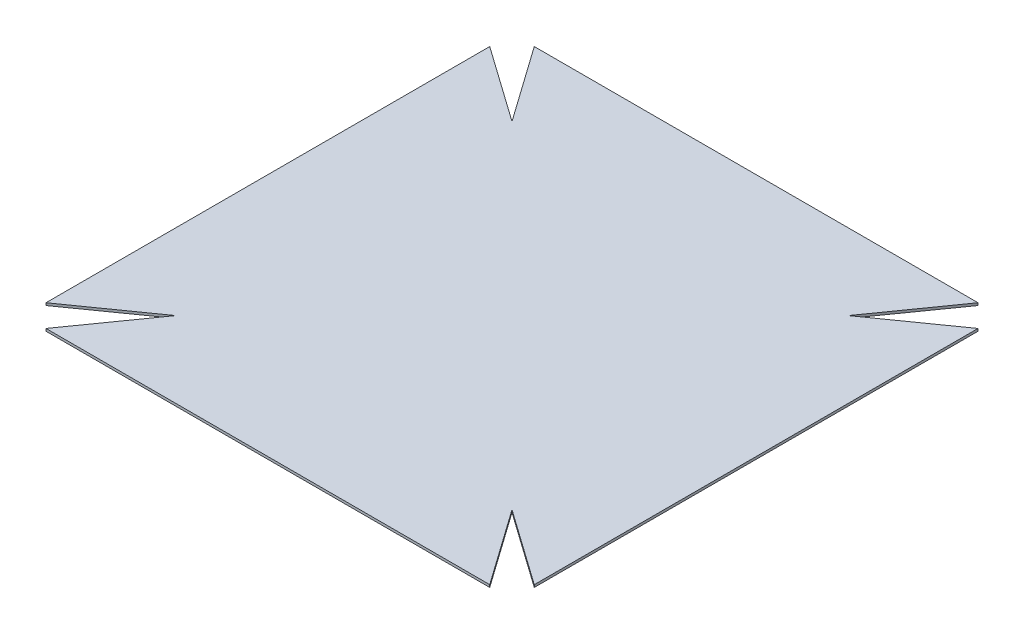
ISO-10303-21;
HEADER;
FILE_DESCRIPTION(('STEP AP214'),'2;1');
FILE_NAME('part.step','',(''),(''),'','','');
FILE_SCHEMA(('AUTOMOTIVE_DESIGN { 1 0 10303 214 1 1 1 1 }'));
ENDSEC;
DATA;
#1=APPLICATION_CONTEXT('core data for automotive mechanical design processes');
#2=APPLICATION_PROTOCOL_DEFINITION('international standard','automotive_design',2000,#1);
#3=PRODUCT_CONTEXT('',#1,'mechanical');
#4=PRODUCT('Part','Part','',(#3));
#5=PRODUCT_RELATED_PRODUCT_CATEGORY('part','',(#4));
#6=PRODUCT_DEFINITION_FORMATION('','',#4);
#7=PRODUCT_DEFINITION_CONTEXT('part definition',#1,'design');
#8=PRODUCT_DEFINITION('design','',#6,#7);
#9=PRODUCT_DEFINITION_SHAPE('','',#8);
#10=(LENGTH_UNIT() NAMED_UNIT(*) SI_UNIT(.MILLI.,.METRE.));
#11=(NAMED_UNIT(*) PLANE_ANGLE_UNIT() SI_UNIT($,.RADIAN.));
#12=(NAMED_UNIT(*) SI_UNIT($,.STERADIAN.) SOLID_ANGLE_UNIT());
#13=UNCERTAINTY_MEASURE_WITH_UNIT(LENGTH_MEASURE(1.E-05),#10,'distance_accuracy_value','');
#14=(GEOMETRIC_REPRESENTATION_CONTEXT(3) GLOBAL_UNCERTAINTY_ASSIGNED_CONTEXT((#13)) GLOBAL_UNIT_ASSIGNED_CONTEXT((#10,
#11,#12)) REPRESENTATION_CONTEXT('',''));
#15=CARTESIAN_POINT('',(0.,0.,0.));
#16=DIRECTION('',(0.,0.,1.));
#17=DIRECTION('',(1.,0.,0.));
#18=AXIS2_PLACEMENT_3D('',#15,#16,#17);
#19=CARTESIAN_POINT('',(0.,-0.50000000000016,-3.98986399474666E-13));
#20=DIRECTION('',(0.,-1.,0.));
#21=DIRECTION('',(0.,0.,-1.));
#22=AXIS2_PLACEMENT_3D('',#19,#20,#21);
#23=PLANE('',#22);
#24=DIRECTION('',(0.57735026918963,0.,-0.816496580927723));
#25=VECTOR('',#24,1.);
#26=CARTESIAN_POINT('',(35.2221825406964,-0.500000000000153,-35.5675341418741));
#27=LINE('',#26,#25);
#28=CARTESIAN_POINT('',(34.3884300213427,-0.500000000000154,-34.3884300213414));
#29=VERTEX_POINT('',#28);
#30=CARTESIAN_POINT('',(45.3894444302746,-0.500000000000261,-49.9462137983145));
#31=VERTEX_POINT('',#30);
#32=EDGE_CURVE('E302',#29,#31,#27,.T.);
#33=ORIENTED_EDGE('',*,*,#32,.F.);
#34=DIRECTION('',(0.816496580927717,0.,-0.577350269189639));
#35=VECTOR('',#34,1.);
#36=CARTESIAN_POINT('',(35.5675341418738,-0.500000000000278,-35.2221825406939));
#37=LINE('',#36,#35);
#38=CARTESIAN_POINT('',(49.946213798314,-0.500000000000216,-45.3894444302722));
#39=VERTEX_POINT('',#38);
#40=EDGE_CURVE('E310',#29,#39,#37,.T.);
#41=ORIENTED_EDGE('',*,*,#40,.T.);
#42=DIRECTION('',(0.,0.,1.));
#43=VECTOR('',#42,1.);
#44=CARTESIAN_POINT('',(49.9462137983152,-0.500000000000507,34.9999999999998));
#45=LINE('',#44,#43);
#46=CARTESIAN_POINT('',(49.9462137983154,-0.500000000000684,45.389444430272));
#47=VERTEX_POINT('',#46);
#48=EDGE_CURVE('E202',#39,#47,#45,.T.);
#49=ORIENTED_EDGE('',*,*,#48,.T.);
#50=DIRECTION('',(0.816496580927738,0.,0.577350269189609));
#51=VECTOR('',#50,1.);
#52=CARTESIAN_POINT('',(35.5675341418751,-0.500000000000403,35.2221825406945));
#53=LINE('',#52,#51);
#54=CARTESIAN_POINT('',(34.3884300213399,-0.500000000000416,34.388430021339));
#55=VERTEX_POINT('',#54);
#56=EDGE_CURVE('E182',#55,#47,#53,.T.);
#57=ORIENTED_EDGE('',*,*,#56,.F.);
#58=DIRECTION('',(0.577350269189628,0.,0.816496580927725));
#59=VECTOR('',#58,1.);
#60=CARTESIAN_POINT('',(35.2221825406947,-0.50000000000016,35.5675341418733));
#61=LINE('',#60,#59);
#62=CARTESIAN_POINT('',(45.3894444302728,-0.500000000000268,49.9462137983137));
#63=VERTEX_POINT('',#62);
#64=EDGE_CURVE('E338',#55,#63,#61,.T.);
#65=ORIENTED_EDGE('',*,*,#64,.T.);
#66=DIRECTION('',(-1.,0.,0.));
#67=VECTOR('',#66,1.);
#68=CARTESIAN_POINT('',(-35.,-0.500000000000257,49.9462137983137));
#69=LINE('',#68,#67);
#70=CARTESIAN_POINT('',(-45.3894444302732,-0.500000000000254,49.9462137983137));
#71=VERTEX_POINT('',#70);
#72=EDGE_CURVE('E267',#63,#71,#69,.T.);
#73=ORIENTED_EDGE('',*,*,#72,.T.);
#74=DIRECTION('',(-0.577350269189629,0.,0.816496580927724));
#75=VECTOR('',#74,1.);
#76=CARTESIAN_POINT('',(-35.2221825406951,-0.50000000000015,35.5675341418733));
#77=LINE('',#76,#75);
#78=CARTESIAN_POINT('',(-34.3884300213423,-0.500000000000139,34.3884300213418));
#79=VERTEX_POINT('',#78);
#80=EDGE_CURVE('E324',#79,#71,#77,.T.);
#81=ORIENTED_EDGE('',*,*,#80,.F.);
#82=DIRECTION('',(-0.816496580927721,0.,0.577350269189633));
#83=VECTOR('',#82,1.);
#84=CARTESIAN_POINT('',(-35.5675341418737,-0.500000000000202,35.2221825406946));
#85=LINE('',#84,#83);
#86=CARTESIAN_POINT('',(-49.946213798314,-0.500000000000309,45.3894444302728));
#87=VERTEX_POINT('',#86);
#88=EDGE_CURVE('E361',#79,#87,#85,.T.);
#89=ORIENTED_EDGE('',*,*,#88,.T.);
#90=DIRECTION('',(0.,0.,-1.));
#91=VECTOR('',#90,1.);
#92=CARTESIAN_POINT('',(-49.9462137983145,-0.500000000000358,-35.0000000000005));
#93=LINE('',#92,#91);
#94=CARTESIAN_POINT('',(-49.9462137983145,-0.500000000000365,-45.3894444302731));
#95=VERTEX_POINT('',#94);
#96=EDGE_CURVE('E245',#87,#95,#93,.T.);
#97=ORIENTED_EDGE('',*,*,#96,.T.);
#98=DIRECTION('',(-0.816496580927727,0.,-0.577350269189624));
#99=VECTOR('',#98,1.);
#100=CARTESIAN_POINT('',(-35.5675341418742,-0.500000000000254,-35.2221825406951));
#101=LINE('',#100,#99);
#102=CARTESIAN_POINT('',(-34.3884300213413,-0.50000000000025,-34.3884300213413));
#103=VERTEX_POINT('',#102);
#104=EDGE_CURVE('E347',#103,#95,#101,.T.);
#105=ORIENTED_EDGE('',*,*,#104,.F.);
#106=DIRECTION('',(-0.577350269189628,0.,-0.816496580927724));
#107=VECTOR('',#106,1.);
#108=CARTESIAN_POINT('',(-35.2221825406951,-0.50000000000016,-35.5675341418741));
#109=LINE('',#108,#107);
#110=CARTESIAN_POINT('',(-45.3894444302732,-0.500000000000254,-49.9462137983145));
#111=VERTEX_POINT('',#110);
#112=EDGE_CURVE('E378',#103,#111,#109,.T.);
#113=ORIENTED_EDGE('',*,*,#112,.T.);
#114=DIRECTION('',(1.,0.,0.));
#115=VECTOR('',#114,1.);
#116=CARTESIAN_POINT('',(35.,-0.500000000000264,-49.9462137983145));
#117=LINE('',#116,#115);
#118=EDGE_CURVE('E223',#111,#31,#117,.T.);
#119=ORIENTED_EDGE('',*,*,#118,.T.);
#120=EDGE_LOOP('',(#33,#41,#49,#57,#65,#73,#81,#89,#97,#105,#113,#119));
#121=FACE_BOUND('',#120,.T.);
#122=ADVANCED_FACE('F172',(#121),#23,.T.);
#123=CARTESIAN_POINT('',(0.,-1.6306400674182E-13,-3.98986399474666E-13));
#124=DIRECTION('',(0.,-1.,0.));
#125=DIRECTION('',(0.,0.,-1.));
#126=AXIS2_PLACEMENT_3D('',#123,#124,#125);
#127=PLANE('',#126);
#128=DIRECTION('',(0.577350269189628,0.,0.816496580927725));
#129=VECTOR('',#128,1.);
#130=CARTESIAN_POINT('',(35.2221825406947,-1.59594559789866E-13,35.5675341418733));
#131=LINE('',#130,#129);
#132=CARTESIAN_POINT('',(34.3884300213399,-4.1589995336544E-13,34.388430021339));
#133=VERTEX_POINT('',#132);
#134=CARTESIAN_POINT('',(45.3894444302728,-2.60208521396521E-13,49.9462137983137));
#135=VERTEX_POINT('',#134);
#136=EDGE_CURVE('E331',#133,#135,#131,.T.);
#137=ORIENTED_EDGE('',*,*,#136,.F.);
#138=DIRECTION('',(0.816496580927738,0.,0.577350269189609));
#139=VECTOR('',#138,1.);
#140=CARTESIAN_POINT('',(35.5675341418751,-4.1286418728248E-13,35.2221825406945));
#141=LINE('',#140,#139);
#142=CARTESIAN_POINT('',(49.9462137983154,-6.76542155630955E-13,45.389444430272));
#143=VERTEX_POINT('',#142);
#144=EDGE_CURVE('E274',#133,#143,#141,.T.);
#145=ORIENTED_EDGE('',*,*,#144,.T.);
#146=DIRECTION('',(0.,0.,1.));
#147=VECTOR('',#146,1.);
#148=CARTESIAN_POINT('',(49.9462137983152,-5.16947595841089E-13,34.9999999999998));
#149=LINE('',#148,#147);
#150=CARTESIAN_POINT('',(49.946213798314,-2.1163626406917E-13,-45.3894444302722));
#151=VERTEX_POINT('',#150);
#152=EDGE_CURVE('E176',#151,#143,#149,.T.);
#153=ORIENTED_EDGE('',*,*,#152,.F.);
#154=DIRECTION('',(0.816496580927717,0.,-0.577350269189639));
#155=VECTOR('',#154,1.);
#156=CARTESIAN_POINT('',(35.5675341418738,-2.74086309204336E-13,-35.2221825406939));
#157=LINE('',#156,#155);
#158=CARTESIAN_POINT('',(34.3884300213427,-1.53523027623947E-13,-34.3884300213414));
#159=VERTEX_POINT('',#158);
#160=EDGE_CURVE('E305',#159,#151,#157,.T.);
#161=ORIENTED_EDGE('',*,*,#160,.F.);
#162=DIRECTION('',(0.57735026918963,0.,-0.816496580927723));
#163=VECTOR('',#162,1.);
#164=CARTESIAN_POINT('',(35.2221825406964,-1.52655665885959E-13,-35.5675341418741));
#165=LINE('',#164,#163);
#166=CARTESIAN_POINT('',(45.3894444302746,-2.53269627492614E-13,-49.9462137983145));
#167=VERTEX_POINT('',#166);
#168=EDGE_CURVE('E296',#159,#167,#165,.T.);
#169=ORIENTED_EDGE('',*,*,#168,.T.);
#170=DIRECTION('',(1.,0.,0.));
#171=VECTOR('',#170,1.);
#172=CARTESIAN_POINT('',(35.,-2.53269627492614E-13,-49.9462137983145));
#173=LINE('',#172,#171);
#174=CARTESIAN_POINT('',(-45.3894444302732,-2.53269627492614E-13,-49.9462137983145));
#175=VERTEX_POINT('',#174);
#176=EDGE_CURVE('E211',#175,#167,#173,.T.);
#177=ORIENTED_EDGE('',*,*,#176,.F.);
#178=DIRECTION('',(-0.577350269189628,0.,-0.816496580927724));
#179=VECTOR('',#178,1.);
#180=CARTESIAN_POINT('',(-35.2221825406951,-1.56125112837913E-13,-35.5675341418741));
#181=LINE('',#180,#179);
#182=CARTESIAN_POINT('',(-34.3884300213413,-2.50233861409654E-13,-34.3884300213413));
#183=VERTEX_POINT('',#182);
#184=EDGE_CURVE('E303',#183,#175,#181,.T.);
#185=ORIENTED_EDGE('',*,*,#184,.F.);
#186=DIRECTION('',(-0.816496580927727,0.,-0.577350269189624));
#187=VECTOR('',#186,1.);
#188=CARTESIAN_POINT('',(-35.5675341418742,-2.60208521396521E-13,-35.2221825406951));
#189=LINE('',#188,#187);
#190=CARTESIAN_POINT('',(-49.9462137983145,-3.57353036051222E-13,-45.3894444302731));
#191=VERTEX_POINT('',#190);
#192=EDGE_CURVE('E350',#183,#191,#189,.T.);
#193=ORIENTED_EDGE('',*,*,#192,.T.);
#194=DIRECTION('',(0.,0.,-1.));
#195=VECTOR('',#194,1.);
#196=CARTESIAN_POINT('',(-49.9462137983145,-3.57353036051222E-13,-35.0000000000005));
#197=LINE('',#196,#195);
#198=CARTESIAN_POINT('',(-49.946213798314,-3.15719672627779E-13,45.3894444302728));
#199=VERTEX_POINT('',#198);
#200=EDGE_CURVE('E233',#199,#191,#197,.T.);
#201=ORIENTED_EDGE('',*,*,#200,.F.);
#202=DIRECTION('',(-0.816496580927721,0.,0.577350269189633));
#203=VECTOR('',#202,1.);
#204=CARTESIAN_POINT('',(-35.5675341418738,-2.0122792321331E-13,35.2221825406946));
#205=LINE('',#204,#203);
#206=CARTESIAN_POINT('',(-34.3884300213423,-1.3910313872989E-13,34.3884300213418));
#207=VERTEX_POINT('',#206);
#208=EDGE_CURVE('E354',#207,#199,#205,.T.);
#209=ORIENTED_EDGE('',*,*,#208,.F.);
#210=DIRECTION('',(-0.577350269189629,0.,0.816496580927724));
#211=VECTOR('',#210,1.);
#212=CARTESIAN_POINT('',(-35.2221825406951,-1.49186218934005E-13,35.5675341418733));
#213=LINE('',#212,#211);
#214=CARTESIAN_POINT('',(-45.3894444302732,-2.4980018054066E-13,49.9462137983137));
#215=VERTEX_POINT('',#214);
#216=EDGE_CURVE('E327',#207,#215,#213,.T.);
#217=ORIENTED_EDGE('',*,*,#216,.T.);
#218=DIRECTION('',(-1.,0.,0.));
#219=VECTOR('',#218,1.);
#220=CARTESIAN_POINT('',(-35.,-2.4980018054066E-13,49.9462137983137));
#221=LINE('',#220,#219);
#222=EDGE_CURVE('E255',#135,#215,#221,.T.);
#223=ORIENTED_EDGE('',*,*,#222,.F.);
#224=EDGE_LOOP('',(#137,#145,#153,#161,#169,#177,#185,#193,#201,#209,#217,#223));
#225=FACE_BOUND('',#224,.T.);
#226=ADVANCED_FACE('F174',(#225),#127,.F.);
#227=CARTESIAN_POINT('',(49.9462137983152,-0.500000000000507,34.9999999999998));
#228=DIRECTION('',(-1.,0.,0.));
#229=DIRECTION('',(0.,-1.,0.));
#230=AXIS2_PLACEMENT_3D('',#227,#228,#229);
#231=PLANE('',#230);
#232=ORIENTED_EDGE('',*,*,#152,.T.);
#233=DIRECTION('',(0.,1.,0.));
#234=VECTOR('',#233,1.);
#235=CARTESIAN_POINT('',(49.9462137983154,-0.500000000000684,45.389444430272));
#236=LINE('',#235,#234);
#237=EDGE_CURVE('E12',#47,#143,#236,.T.);
#238=ORIENTED_EDGE('',*,*,#237,.F.);
#239=ORIENTED_EDGE('',*,*,#48,.F.);
#240=DIRECTION('',(0.,1.,0.));
#241=VECTOR('',#240,1.);
#242=CARTESIAN_POINT('',(49.946213798314,-0.500000000000216,-45.3894444302722));
#243=LINE('',#242,#241);
#244=EDGE_CURVE('E396',#39,#151,#243,.T.);
#245=ORIENTED_EDGE('',*,*,#244,.T.);
#246=EDGE_LOOP('',(#232,#238,#239,#245));
#247=FACE_BOUND('',#246,.T.);
#248=ADVANCED_FACE('F398',(#247),#231,.F.);
#249=CARTESIAN_POINT('',(35.5675341418738,-0.500000000000278,-35.2221825406939));
#250=DIRECTION('',(0.577350269189639,0.,0.816496580927717));
#251=DIRECTION('',(0.816496580927717,0.,-0.577350269189639));
#252=AXIS2_PLACEMENT_3D('',#249,#250,#251);
#253=PLANE('',#252);
#254=ORIENTED_EDGE('',*,*,#160,.T.);
#255=ORIENTED_EDGE('',*,*,#244,.F.);
#256=ORIENTED_EDGE('',*,*,#40,.F.);
#257=DIRECTION('',(0.,-1.,0.));
#258=VECTOR('',#257,1.);
#259=CARTESIAN_POINT('',(34.3884300213427,-1.53523027623947E-13,-34.3884300213414));
#260=LINE('',#259,#258);
#261=EDGE_CURVE('E300',#159,#29,#260,.T.);
#262=ORIENTED_EDGE('',*,*,#261,.F.);
#263=EDGE_LOOP('',(#254,#255,#256,#262));
#264=FACE_BOUND('',#263,.T.);
#265=ADVANCED_FACE('F309',(#264),#253,.F.);
#266=CARTESIAN_POINT('',(35.5675341418751,-0.500000000000403,35.2221825406945));
#267=DIRECTION('',(-0.57735026918961,0.,0.816496580927738));
#268=DIRECTION('',(-0.707106781186563,-0.499999999999991,-0.499999999999988));
#269=AXIS2_PLACEMENT_3D('',#266,#267,#268);
#270=PLANE('',#269);
#271=ORIENTED_EDGE('',*,*,#144,.F.);
#272=DIRECTION('',(0.,-1.,0.));
#273=VECTOR('',#272,1.);
#274=CARTESIAN_POINT('',(34.3884300213399,-4.1589995336544E-13,34.388430021339));
#275=LINE('',#274,#273);
#276=EDGE_CURVE('E312',#133,#55,#275,.T.);
#277=ORIENTED_EDGE('',*,*,#276,.T.);
#278=ORIENTED_EDGE('',*,*,#56,.T.);
#279=ORIENTED_EDGE('',*,*,#237,.T.);
#280=EDGE_LOOP('',(#271,#277,#278,#279));
#281=FACE_BOUND('',#280,.T.);
#282=ADVANCED_FACE('F405',(#281),#270,.T.);
#283=CARTESIAN_POINT('',(35.,-0.500000000000264,-49.9462137983145));
#284=DIRECTION('',(0.,0.,1.));
#285=DIRECTION('',(0.,-1.,0.));
#286=AXIS2_PLACEMENT_3D('',#283,#284,#285);
#287=PLANE('',#286);
#288=ORIENTED_EDGE('',*,*,#176,.T.);
#289=DIRECTION('',(0.,1.,0.));
#290=VECTOR('',#289,1.);
#291=CARTESIAN_POINT('',(45.3894444302746,-0.500000000000261,-49.9462137983145));
#292=LINE('',#291,#290);
#293=EDGE_CURVE('E301',#31,#167,#292,.T.);
#294=ORIENTED_EDGE('',*,*,#293,.F.);
#295=ORIENTED_EDGE('',*,*,#118,.F.);
#296=DIRECTION('',(0.,1.,0.));
#297=VECTOR('',#296,1.);
#298=CARTESIAN_POINT('',(-45.3894444302732,-0.500000000000254,-49.9462137983145));
#299=LINE('',#298,#297);
#300=EDGE_CURVE('E380',#111,#175,#299,.T.);
#301=ORIENTED_EDGE('',*,*,#300,.T.);
#302=EDGE_LOOP('',(#288,#294,#295,#301));
#303=FACE_BOUND('',#302,.T.);
#304=ADVANCED_FACE('F414',(#303),#287,.F.);
#305=CARTESIAN_POINT('',(-35.2221825406951,-0.50000000000016,-35.5675341418741));
#306=DIRECTION('',(0.816496580927724,0.,-0.577350269189628));
#307=DIRECTION('',(-0.577350269189628,0.,-0.816496580927725));
#308=AXIS2_PLACEMENT_3D('',#305,#306,#307);
#309=PLANE('',#308);
#310=ORIENTED_EDGE('',*,*,#184,.T.);
#311=ORIENTED_EDGE('',*,*,#300,.F.);
#312=ORIENTED_EDGE('',*,*,#112,.F.);
#313=DIRECTION('',(0.,-1.,0.));
#314=VECTOR('',#313,1.);
#315=CARTESIAN_POINT('',(-34.3884300213413,-2.50233861409654E-13,-34.3884300213413));
#316=LINE('',#315,#314);
#317=EDGE_CURVE('E313',#183,#103,#316,.T.);
#318=ORIENTED_EDGE('',*,*,#317,.F.);
#319=EDGE_LOOP('',(#310,#311,#312,#318));
#320=FACE_BOUND('',#319,.T.);
#321=ADVANCED_FACE('F418',(#320),#309,.F.);
#322=CARTESIAN_POINT('',(35.2221825406964,-0.500000000000153,-35.5675341418741));
#323=DIRECTION('',(0.816496580927723,0.,0.57735026918963));
#324=DIRECTION('',(0.57735026918963,0.,-0.816496580927723));
#325=AXIS2_PLACEMENT_3D('',#322,#323,#324);
#326=PLANE('',#325);
#327=ORIENTED_EDGE('',*,*,#168,.F.);
#328=ORIENTED_EDGE('',*,*,#261,.T.);
#329=ORIENTED_EDGE('',*,*,#32,.T.);
#330=ORIENTED_EDGE('',*,*,#293,.T.);
#331=EDGE_LOOP('',(#327,#328,#329,#330));
#332=FACE_BOUND('',#331,.T.);
#333=ADVANCED_FACE('F297',(#332),#326,.T.);
#334=CARTESIAN_POINT('',(-49.9462137983145,-0.500000000000358,-35.0000000000005));
#335=DIRECTION('',(1.,0.,0.));
#336=DIRECTION('',(0.,1.,0.));
#337=AXIS2_PLACEMENT_3D('',#334,#335,#336);
#338=PLANE('',#337);
#339=ORIENTED_EDGE('',*,*,#200,.T.);
#340=DIRECTION('',(0.,1.,0.));
#341=VECTOR('',#340,1.);
#342=CARTESIAN_POINT('',(-49.9462137983145,-0.500000000000365,-45.3894444302731));
#343=LINE('',#342,#341);
#344=EDGE_CURVE('E345',#95,#191,#343,.T.);
#345=ORIENTED_EDGE('',*,*,#344,.F.);
#346=ORIENTED_EDGE('',*,*,#96,.F.);
#347=DIRECTION('',(0.,1.,0.));
#348=VECTOR('',#347,1.);
#349=CARTESIAN_POINT('',(-49.946213798314,-0.500000000000309,45.3894444302728));
#350=LINE('',#349,#348);
#351=EDGE_CURVE('E363',#87,#199,#350,.T.);
#352=ORIENTED_EDGE('',*,*,#351,.T.);
#353=EDGE_LOOP('',(#339,#345,#346,#352));
#354=FACE_BOUND('',#353,.T.);
#355=ADVANCED_FACE('F429',(#354),#338,.F.);
#356=CARTESIAN_POINT('',(-35.5675341418737,-0.500000000000202,35.2221825406946));
#357=DIRECTION('',(-0.577350269189634,0.,-0.816496580927721));
#358=DIRECTION('',(-0.816496580927721,0.,0.577350269189634));
#359=AXIS2_PLACEMENT_3D('',#356,#357,#358);
#360=PLANE('',#359);
#361=ORIENTED_EDGE('',*,*,#208,.T.);
#362=ORIENTED_EDGE('',*,*,#351,.F.);
#363=ORIENTED_EDGE('',*,*,#88,.F.);
#364=DIRECTION('',(0.,-1.,0.));
#365=VECTOR('',#364,1.);
#366=CARTESIAN_POINT('',(-34.3884300213423,-1.3910313872989E-13,34.3884300213418));
#367=LINE('',#366,#365);
#368=EDGE_CURVE('E317',#207,#79,#367,.T.);
#369=ORIENTED_EDGE('',*,*,#368,.F.);
#370=EDGE_LOOP('',(#361,#362,#363,#369));
#371=FACE_BOUND('',#370,.T.);
#372=ADVANCED_FACE('F433',(#371),#360,.F.);
#373=CARTESIAN_POINT('',(-35.5675341418742,-0.500000000000254,-35.2221825406951));
#374=DIRECTION('',(0.577350269189624,0.,-0.816496580927727));
#375=DIRECTION('',(-0.816496580927727,0.,-0.577350269189624));
#376=AXIS2_PLACEMENT_3D('',#373,#374,#375);
#377=PLANE('',#376);
#378=ORIENTED_EDGE('',*,*,#192,.F.);
#379=ORIENTED_EDGE('',*,*,#317,.T.);
#380=ORIENTED_EDGE('',*,*,#104,.T.);
#381=ORIENTED_EDGE('',*,*,#344,.T.);
#382=EDGE_LOOP('',(#378,#379,#380,#381));
#383=FACE_BOUND('',#382,.T.);
#384=ADVANCED_FACE('F426',(#383),#377,.T.);
#385=CARTESIAN_POINT('',(-35.,-0.500000000000257,49.9462137983137));
#386=DIRECTION('',(0.,0.,-1.));
#387=DIRECTION('',(0.,1.,0.));
#388=AXIS2_PLACEMENT_3D('',#385,#386,#387);
#389=PLANE('',#388);
#390=ORIENTED_EDGE('',*,*,#222,.T.);
#391=DIRECTION('',(0.,1.,0.));
#392=VECTOR('',#391,1.);
#393=CARTESIAN_POINT('',(-45.3894444302732,-0.500000000000254,49.9462137983137));
#394=LINE('',#393,#392);
#395=EDGE_CURVE('E322',#71,#215,#394,.T.);
#396=ORIENTED_EDGE('',*,*,#395,.F.);
#397=ORIENTED_EDGE('',*,*,#72,.F.);
#398=DIRECTION('',(0.,1.,0.));
#399=VECTOR('',#398,1.);
#400=CARTESIAN_POINT('',(45.3894444302728,-0.500000000000268,49.9462137983137));
#401=LINE('',#400,#399);
#402=EDGE_CURVE('E340',#63,#135,#401,.T.);
#403=ORIENTED_EDGE('',*,*,#402,.T.);
#404=EDGE_LOOP('',(#390,#396,#397,#403));
#405=FACE_BOUND('',#404,.T.);
#406=ADVANCED_FACE('F447',(#405),#389,.F.);
#407=CARTESIAN_POINT('',(35.2221825406947,-0.50000000000016,35.5675341418733));
#408=DIRECTION('',(-0.816496580927724,0.,0.577350269189628));
#409=DIRECTION('',(0.447213595499962,-0.632455532033676,0.632455532033674));
#410=AXIS2_PLACEMENT_3D('',#407,#408,#409);
#411=PLANE('',#410);
#412=ORIENTED_EDGE('',*,*,#136,.T.);
#413=ORIENTED_EDGE('',*,*,#402,.F.);
#414=ORIENTED_EDGE('',*,*,#64,.F.);
#415=ORIENTED_EDGE('',*,*,#276,.F.);
#416=EDGE_LOOP('',(#412,#413,#414,#415));
#417=FACE_BOUND('',#416,.T.);
#418=ADVANCED_FACE('F443',(#417),#411,.F.);
#419=CARTESIAN_POINT('',(-35.2221825406951,-0.50000000000015,35.5675341418733));
#420=DIRECTION('',(-0.816496580927723,0.,-0.57735026918963));
#421=DIRECTION('',(-0.577350269189629,0.,0.816496580927724));
#422=AXIS2_PLACEMENT_3D('',#419,#420,#421);
#423=PLANE('',#422);
#424=ORIENTED_EDGE('',*,*,#216,.F.);
#425=ORIENTED_EDGE('',*,*,#368,.T.);
#426=ORIENTED_EDGE('',*,*,#80,.T.);
#427=ORIENTED_EDGE('',*,*,#395,.T.);
#428=EDGE_LOOP('',(#424,#425,#426,#427));
#429=FACE_BOUND('',#428,.T.);
#430=ADVANCED_FACE('F440',(#429),#423,.T.);
#431=CLOSED_SHELL('',(#122,#226,#248,#265,#282,#304,#321,#333,#355,#372,#384,#406,#418,#430));
#432=MANIFOLD_SOLID_BREP('B2',#431);
#433=ADVANCED_BREP_SHAPE_REPRESENTATION('',(#18,#432),#14);
#434=SHAPE_DEFINITION_REPRESENTATION(#9,#433);
ENDSEC;
END-ISO-10303-21;
